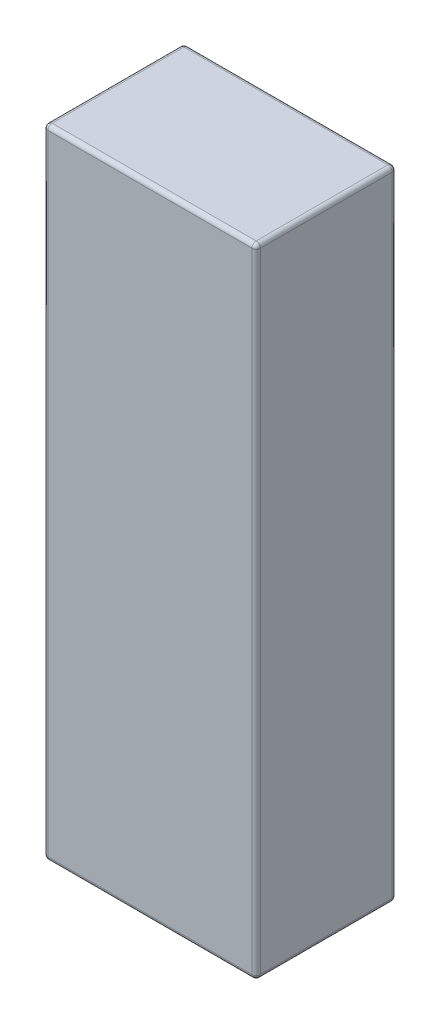
ISO-10303-21;
HEADER;
FILE_DESCRIPTION(('STEP AP214'),'2;1');
FILE_NAME('part.step','',(''),(''),'','','');
FILE_SCHEMA(('AUTOMOTIVE_DESIGN { 1 0 10303 214 1 1 1 1 }'));
ENDSEC;
DATA;
#1=APPLICATION_CONTEXT('core data for automotive mechanical design processes');
#2=APPLICATION_PROTOCOL_DEFINITION('international standard','automotive_design',2000,#1);
#3=PRODUCT_CONTEXT('',#1,'mechanical');
#4=PRODUCT('Part','Part','',(#3));
#5=PRODUCT_RELATED_PRODUCT_CATEGORY('part','',(#4));
#6=PRODUCT_DEFINITION_FORMATION('','',#4);
#7=PRODUCT_DEFINITION_CONTEXT('part definition',#1,'design');
#8=PRODUCT_DEFINITION('design','',#6,#7);
#9=PRODUCT_DEFINITION_SHAPE('','',#8);
#10=(LENGTH_UNIT() NAMED_UNIT(*) SI_UNIT(.MILLI.,.METRE.));
#11=(NAMED_UNIT(*) PLANE_ANGLE_UNIT() SI_UNIT($,.RADIAN.));
#12=(NAMED_UNIT(*) SI_UNIT($,.STERADIAN.) SOLID_ANGLE_UNIT());
#13=UNCERTAINTY_MEASURE_WITH_UNIT(LENGTH_MEASURE(1.E-05),#10,'distance_accuracy_value','');
#14=(GEOMETRIC_REPRESENTATION_CONTEXT(3) GLOBAL_UNCERTAINTY_ASSIGNED_CONTEXT((#13)) GLOBAL_UNIT_ASSIGNED_CONTEXT((#10,
#11,#12)) REPRESENTATION_CONTEXT('',''));
#15=CARTESIAN_POINT('',(0.,0.,0.));
#16=DIRECTION('',(0.,0.,1.));
#17=DIRECTION('',(1.,0.,0.));
#18=AXIS2_PLACEMENT_3D('',#15,#16,#17);
#19=CARTESIAN_POINT('',(25.,75.,16.5));
#20=DIRECTION('',(-1.,0.,0.));
#21=DIRECTION('',(0.,0.,1.));
#22=AXIS2_PLACEMENT_3D('',#19,#20,#21);
#23=PLANE('',#22);
#24=DIRECTION('',(0.,-1.,0.));
#25=VECTOR('',#24,1.);
#26=CARTESIAN_POINT('',(25.,75.,15.5));
#27=LINE('',#26,#25);
#28=CARTESIAN_POINT('',(25.,74.,15.5));
#29=VERTEX_POINT('',#28);
#30=CARTESIAN_POINT('',(25.,-74.,15.5));
#31=VERTEX_POINT('',#30);
#32=EDGE_CURVE('E166',#29,#31,#27,.T.);
#33=ORIENTED_EDGE('',*,*,#32,.T.);
#34=DIRECTION('',(0.,0.,-1.));
#35=VECTOR('',#34,1.);
#36=CARTESIAN_POINT('',(25.,-74.,-16.5));
#37=LINE('',#36,#35);
#38=CARTESIAN_POINT('',(25.,-74.,-15.5));
#39=VERTEX_POINT('',#38);
#40=EDGE_CURVE('E171',#31,#39,#37,.T.);
#41=ORIENTED_EDGE('',*,*,#40,.T.);
#42=DIRECTION('',(0.,-1.,0.));
#43=VECTOR('',#42,1.);
#44=CARTESIAN_POINT('',(25.,75.,-15.5));
#45=LINE('',#44,#43);
#46=CARTESIAN_POINT('',(25.,74.,-15.5));
#47=VERTEX_POINT('',#46);
#48=EDGE_CURVE('E168',#39,#47,#45,.F.);
#49=ORIENTED_EDGE('',*,*,#48,.T.);
#50=DIRECTION('',(0.,0.,-1.));
#51=VECTOR('',#50,1.);
#52=CARTESIAN_POINT('',(25.,74.,16.5));
#53=LINE('',#52,#51);
#54=EDGE_CURVE('E164',#47,#29,#53,.F.);
#55=ORIENTED_EDGE('',*,*,#54,.T.);
#56=EDGE_LOOP('',(#33,#41,#49,#55));
#57=FACE_BOUND('',#56,.T.);
#58=ADVANCED_FACE('F33',(#57),#23,.F.);
#59=CARTESIAN_POINT('',(-25.,75.,-16.5));
#60=DIRECTION('',(0.,0.,1.));
#61=DIRECTION('',(1.,0.,0.));
#62=AXIS2_PLACEMENT_3D('',#59,#60,#61);
#63=PLANE('',#62);
#64=DIRECTION('',(0.,-1.,0.));
#65=VECTOR('',#64,1.);
#66=CARTESIAN_POINT('',(24.,75.,-16.5));
#67=LINE('',#66,#65);
#68=CARTESIAN_POINT('',(24.,74.,-16.5));
#69=VERTEX_POINT('',#68);
#70=CARTESIAN_POINT('',(24.,-74.,-16.5));
#71=VERTEX_POINT('',#70);
#72=EDGE_CURVE('E132',#69,#71,#67,.T.);
#73=ORIENTED_EDGE('',*,*,#72,.T.);
#74=DIRECTION('',(-1.,0.,0.));
#75=VECTOR('',#74,1.);
#76=CARTESIAN_POINT('',(-25.,-74.,-16.5));
#77=LINE('',#76,#75);
#78=CARTESIAN_POINT('',(-24.,-74.,-16.5));
#79=VERTEX_POINT('',#78);
#80=EDGE_CURVE('E128',#71,#79,#77,.T.);
#81=ORIENTED_EDGE('',*,*,#80,.T.);
#82=DIRECTION('',(0.,-1.,0.));
#83=VECTOR('',#82,1.);
#84=CARTESIAN_POINT('',(-24.,75.,-16.5));
#85=LINE('',#84,#83);
#86=CARTESIAN_POINT('',(-24.,74.,-16.5));
#87=VERTEX_POINT('',#86);
#88=EDGE_CURVE('E120',#79,#87,#85,.F.);
#89=ORIENTED_EDGE('',*,*,#88,.T.);
#90=DIRECTION('',(-1.,0.,0.));
#91=VECTOR('',#90,1.);
#92=CARTESIAN_POINT('',(-25.,74.,-16.5));
#93=LINE('',#92,#91);
#94=EDGE_CURVE('E125',#87,#69,#93,.F.);
#95=ORIENTED_EDGE('',*,*,#94,.T.);
#96=EDGE_LOOP('',(#73,#81,#89,#95));
#97=FACE_BOUND('',#96,.T.);
#98=ADVANCED_FACE('F123',(#97),#63,.F.);
#99=CARTESIAN_POINT('',(-25.,75.,16.5));
#100=DIRECTION('',(1.,0.,0.));
#101=DIRECTION('',(0.,0.,-1.));
#102=AXIS2_PLACEMENT_3D('',#99,#100,#101);
#103=PLANE('',#102);
#104=DIRECTION('',(0.,-1.,0.));
#105=VECTOR('',#104,1.);
#106=CARTESIAN_POINT('',(-25.,75.,-15.5));
#107=LINE('',#106,#105);
#108=CARTESIAN_POINT('',(-25.,74.,-15.5));
#109=VERTEX_POINT('',#108);
#110=CARTESIAN_POINT('',(-25.,-74.,-15.5));
#111=VERTEX_POINT('',#110);
#112=EDGE_CURVE('E140',#109,#111,#107,.T.);
#113=ORIENTED_EDGE('',*,*,#112,.T.);
#114=DIRECTION('',(0.,0.,1.));
#115=VECTOR('',#114,1.);
#116=CARTESIAN_POINT('',(-25.,-74.,16.5));
#117=LINE('',#116,#115);
#118=CARTESIAN_POINT('',(-25.,-74.,15.5));
#119=VERTEX_POINT('',#118);
#120=EDGE_CURVE('E178',#111,#119,#117,.T.);
#121=ORIENTED_EDGE('',*,*,#120,.T.);
#122=DIRECTION('',(0.,-1.,0.));
#123=VECTOR('',#122,1.);
#124=CARTESIAN_POINT('',(-25.,75.,15.5));
#125=LINE('',#124,#123);
#126=CARTESIAN_POINT('',(-25.,74.,15.5));
#127=VERTEX_POINT('',#126);
#128=EDGE_CURVE('E175',#119,#127,#125,.F.);
#129=ORIENTED_EDGE('',*,*,#128,.T.);
#130=DIRECTION('',(0.,0.,1.));
#131=VECTOR('',#130,1.);
#132=CARTESIAN_POINT('',(-25.,74.,16.5));
#133=LINE('',#132,#131);
#134=EDGE_CURVE('E173',#127,#109,#133,.F.);
#135=ORIENTED_EDGE('',*,*,#134,.T.);
#136=EDGE_LOOP('',(#113,#121,#129,#135));
#137=FACE_BOUND('',#136,.T.);
#138=ADVANCED_FACE('F324',(#137),#103,.F.);
#139=CARTESIAN_POINT('',(-25.,75.,16.5));
#140=DIRECTION('',(0.,0.,-1.));
#141=DIRECTION('',(-1.,0.,0.));
#142=AXIS2_PLACEMENT_3D('',#139,#140,#141);
#143=PLANE('',#142);
#144=DIRECTION('',(0.,-1.,0.));
#145=VECTOR('',#144,1.);
#146=CARTESIAN_POINT('',(-24.,75.,16.5));
#147=LINE('',#146,#145);
#148=CARTESIAN_POINT('',(-24.,74.,16.5));
#149=VERTEX_POINT('',#148);
#150=CARTESIAN_POINT('',(-24.,-74.,16.5));
#151=VERTEX_POINT('',#150);
#152=EDGE_CURVE('E184',#149,#151,#147,.T.);
#153=ORIENTED_EDGE('',*,*,#152,.T.);
#154=DIRECTION('',(1.,0.,0.));
#155=VECTOR('',#154,1.);
#156=CARTESIAN_POINT('',(25.,-74.,16.5));
#157=LINE('',#156,#155);
#158=CARTESIAN_POINT('',(24.,-74.,16.5));
#159=VERTEX_POINT('',#158);
#160=EDGE_CURVE('E187',#151,#159,#157,.T.);
#161=ORIENTED_EDGE('',*,*,#160,.T.);
#162=DIRECTION('',(0.,-1.,0.));
#163=VECTOR('',#162,1.);
#164=CARTESIAN_POINT('',(24.,75.,16.5));
#165=LINE('',#164,#163);
#166=CARTESIAN_POINT('',(24.,74.,16.5));
#167=VERTEX_POINT('',#166);
#168=EDGE_CURVE('E182',#159,#167,#165,.F.);
#169=ORIENTED_EDGE('',*,*,#168,.T.);
#170=DIRECTION('',(1.,0.,0.));
#171=VECTOR('',#170,1.);
#172=CARTESIAN_POINT('',(-25.,74.,16.5));
#173=LINE('',#172,#171);
#174=EDGE_CURVE('E180',#167,#149,#173,.F.);
#175=ORIENTED_EDGE('',*,*,#174,.T.);
#176=EDGE_LOOP('',(#153,#161,#169,#175));
#177=FACE_BOUND('',#176,.T.);
#178=ADVANCED_FACE('F273',(#177),#143,.F.);
#179=CARTESIAN_POINT('',(0.,75.,0.));
#180=DIRECTION('',(0.,-1.,0.));
#181=DIRECTION('',(0.,0.,-1.));
#182=AXIS2_PLACEMENT_3D('',#179,#180,#181);
#183=PLANE('',#182);
#184=DIRECTION('',(0.,0.,1.));
#185=VECTOR('',#184,1.);
#186=CARTESIAN_POINT('',(-24.,75.,0.));
#187=LINE('',#186,#185);
#188=CARTESIAN_POINT('',(-24.,75.,-15.5));
#189=VERTEX_POINT('',#188);
#190=CARTESIAN_POINT('',(-24.,75.,15.5));
#191=VERTEX_POINT('',#190);
#192=EDGE_CURVE('E42',#189,#191,#187,.T.);
#193=ORIENTED_EDGE('',*,*,#192,.T.);
#194=DIRECTION('',(1.,0.,0.));
#195=VECTOR('',#194,1.);
#196=CARTESIAN_POINT('',(0.,75.,15.5));
#197=LINE('',#196,#195);
#198=CARTESIAN_POINT('',(24.,75.,15.5));
#199=VERTEX_POINT('',#198);
#200=EDGE_CURVE('E11',#191,#199,#197,.T.);
#201=ORIENTED_EDGE('',*,*,#200,.T.);
#202=DIRECTION('',(0.,0.,-1.));
#203=VECTOR('',#202,1.);
#204=CARTESIAN_POINT('',(24.,75.,0.));
#205=LINE('',#204,#203);
#206=CARTESIAN_POINT('',(24.,75.,-15.5));
#207=VERTEX_POINT('',#206);
#208=EDGE_CURVE('E198',#199,#207,#205,.T.);
#209=ORIENTED_EDGE('',*,*,#208,.T.);
#210=DIRECTION('',(-1.,0.,0.));
#211=VECTOR('',#210,1.);
#212=CARTESIAN_POINT('',(0.,75.,-15.5));
#213=LINE('',#212,#211);
#214=EDGE_CURVE('E53',#207,#189,#213,.T.);
#215=ORIENTED_EDGE('',*,*,#214,.T.);
#216=EDGE_LOOP('',(#193,#201,#209,#215));
#217=FACE_BOUND('',#216,.T.);
#218=ADVANCED_FACE('F288',(#217),#183,.F.);
#219=CARTESIAN_POINT('',(0.,-75.,0.));
#220=DIRECTION('',(0.,-1.,0.));
#221=DIRECTION('',(0.,0.,-1.));
#222=AXIS2_PLACEMENT_3D('',#219,#220,#221);
#223=PLANE('',#222);
#224=DIRECTION('',(0.,0.,1.));
#225=VECTOR('',#224,1.);
#226=CARTESIAN_POINT('',(-24.,-75.,-16.5));
#227=LINE('',#226,#225);
#228=CARTESIAN_POINT('',(-24.,-75.,15.5));
#229=VERTEX_POINT('',#228);
#230=CARTESIAN_POINT('',(-24.,-75.,-15.5));
#231=VERTEX_POINT('',#230);
#232=EDGE_CURVE('E193',#229,#231,#227,.F.);
#233=ORIENTED_EDGE('',*,*,#232,.T.);
#234=DIRECTION('',(-1.,0.,0.));
#235=VECTOR('',#234,1.);
#236=CARTESIAN_POINT('',(25.,-75.,-15.5));
#237=LINE('',#236,#235);
#238=CARTESIAN_POINT('',(24.,-75.,-15.5));
#239=VERTEX_POINT('',#238);
#240=EDGE_CURVE('E195',#231,#239,#237,.F.);
#241=ORIENTED_EDGE('',*,*,#240,.T.);
#242=DIRECTION('',(0.,0.,-1.));
#243=VECTOR('',#242,1.);
#244=CARTESIAN_POINT('',(24.,-75.,16.5));
#245=LINE('',#244,#243);
#246=CARTESIAN_POINT('',(24.,-75.,15.5));
#247=VERTEX_POINT('',#246);
#248=EDGE_CURVE('E189',#239,#247,#245,.F.);
#249=ORIENTED_EDGE('',*,*,#248,.T.);
#250=DIRECTION('',(1.,0.,0.));
#251=VECTOR('',#250,1.);
#252=CARTESIAN_POINT('',(-25.,-75.,15.5));
#253=LINE('',#252,#251);
#254=EDGE_CURVE('E191',#247,#229,#253,.F.);
#255=ORIENTED_EDGE('',*,*,#254,.T.);
#256=EDGE_LOOP('',(#233,#241,#249,#255));
#257=FACE_BOUND('',#256,.T.);
#258=ADVANCED_FACE('F264',(#257),#223,.T.);
#259=CARTESIAN_POINT('',(-24.,75.,15.5));
#260=DIRECTION('',(0.,-1.,0.));
#261=DIRECTION('',(0.,0.,-1.));
#262=AXIS2_PLACEMENT_3D('',#259,#260,#261);
#263=CYLINDRICAL_SURFACE('',#262,1.);
#264=CARTESIAN_POINT('',(-24.,74.,15.5));
#265=DIRECTION('',(0.,1.,0.));
#266=DIRECTION('',(0.,0.,1.));
#267=AXIS2_PLACEMENT_3D('',#264,#265,#266);
#268=CIRCLE('',#267,1.);
#269=EDGE_CURVE('E37',#127,#149,#268,.T.);
#270=ORIENTED_EDGE('',*,*,#269,.F.);
#271=ORIENTED_EDGE('',*,*,#128,.F.);
#272=CARTESIAN_POINT('',(-24.,-74.,15.5));
#273=DIRECTION('',(0.,-1.,0.));
#274=DIRECTION('',(0.,0.,-1.));
#275=AXIS2_PLACEMENT_3D('',#272,#273,#274);
#276=CIRCLE('',#275,1.);
#277=EDGE_CURVE('E160',#151,#119,#276,.T.);
#278=ORIENTED_EDGE('',*,*,#277,.F.);
#279=ORIENTED_EDGE('',*,*,#152,.F.);
#280=EDGE_LOOP('',(#270,#271,#278,#279));
#281=FACE_BOUND('',#280,.T.);
#282=ADVANCED_FACE('F35',(#281),#263,.T.);
#283=CARTESIAN_POINT('',(-24.,74.,15.5));
#284=DIRECTION('',(0.,0.,1.));
#285=DIRECTION('',(1.,0.,0.));
#286=AXIS2_PLACEMENT_3D('',#283,#284,#285);
#287=SPHERICAL_SURFACE('',#286,1.);
#288=CARTESIAN_POINT('',(-24.,74.,15.5));
#289=DIRECTION('',(0.,0.,1.));
#290=DIRECTION('',(1.,0.,0.));
#291=AXIS2_PLACEMENT_3D('',#288,#289,#290);
#292=CIRCLE('',#291,1.);
#293=EDGE_CURVE('E244',#127,#191,#292,.F.);
#294=ORIENTED_EDGE('',*,*,#293,.F.);
#295=ORIENTED_EDGE('',*,*,#269,.T.);
#296=CARTESIAN_POINT('',(-24.,74.,15.5));
#297=DIRECTION('',(-1.,0.,0.));
#298=DIRECTION('',(0.,0.,1.));
#299=AXIS2_PLACEMENT_3D('',#296,#297,#298);
#300=CIRCLE('',#299,1.);
#301=EDGE_CURVE('E246',#191,#149,#300,.F.);
#302=ORIENTED_EDGE('',*,*,#301,.F.);
#303=EDGE_LOOP('',(#294,#295,#302));
#304=FACE_BOUND('',#303,.T.);
#305=ADVANCED_FACE('F457',(#304),#287,.T.);
#306=CARTESIAN_POINT('',(-24.,-74.,15.5));
#307=DIRECTION('',(0.,0.,1.));
#308=DIRECTION('',(1.,0.,0.));
#309=AXIS2_PLACEMENT_3D('',#306,#307,#308);
#310=SPHERICAL_SURFACE('',#309,1.);
#311=CARTESIAN_POINT('',(-24.,-74.,15.5));
#312=DIRECTION('',(-1.,0.,0.));
#313=DIRECTION('',(0.,0.,1.));
#314=AXIS2_PLACEMENT_3D('',#311,#312,#313);
#315=CIRCLE('',#314,1.);
#316=EDGE_CURVE('E238',#151,#229,#315,.F.);
#317=ORIENTED_EDGE('',*,*,#316,.F.);
#318=ORIENTED_EDGE('',*,*,#277,.T.);
#319=CARTESIAN_POINT('',(-24.,-74.,15.5));
#320=DIRECTION('',(0.,0.,1.));
#321=DIRECTION('',(1.,0.,0.));
#322=AXIS2_PLACEMENT_3D('',#319,#320,#321);
#323=CIRCLE('',#322,1.);
#324=EDGE_CURVE('E241',#229,#119,#323,.F.);
#325=ORIENTED_EDGE('',*,*,#324,.F.);
#326=EDGE_LOOP('',(#317,#318,#325));
#327=FACE_BOUND('',#326,.T.);
#328=ADVANCED_FACE('F253',(#327),#310,.T.);
#329=CARTESIAN_POINT('',(0.,74.,15.5));
#330=DIRECTION('',(1.,0.,0.));
#331=DIRECTION('',(0.,0.,-1.));
#332=AXIS2_PLACEMENT_3D('',#329,#330,#331);
#333=CYLINDRICAL_SURFACE('',#332,1.);
#334=ORIENTED_EDGE('',*,*,#301,.T.);
#335=ORIENTED_EDGE('',*,*,#174,.F.);
#336=CARTESIAN_POINT('',(24.,74.,15.5));
#337=DIRECTION('',(1.,0.,0.));
#338=DIRECTION('',(0.,0.,-1.));
#339=AXIS2_PLACEMENT_3D('',#336,#337,#338);
#340=CIRCLE('',#339,1.);
#341=EDGE_CURVE('E232',#199,#167,#340,.T.);
#342=ORIENTED_EDGE('',*,*,#341,.F.);
#343=ORIENTED_EDGE('',*,*,#200,.F.);
#344=EDGE_LOOP('',(#334,#335,#342,#343));
#345=FACE_BOUND('',#344,.T.);
#346=ADVANCED_FACE('F287',(#345),#333,.T.);
#347=CARTESIAN_POINT('',(-24.,74.,0.));
#348=DIRECTION('',(0.,0.,1.));
#349=DIRECTION('',(1.,0.,0.));
#350=AXIS2_PLACEMENT_3D('',#347,#348,#349);
#351=CYLINDRICAL_SURFACE('',#350,1.);
#352=ORIENTED_EDGE('',*,*,#293,.T.);
#353=ORIENTED_EDGE('',*,*,#192,.F.);
#354=CARTESIAN_POINT('',(-24.,74.,-15.5));
#355=DIRECTION('',(0.,0.,-1.));
#356=DIRECTION('',(-1.,0.,0.));
#357=AXIS2_PLACEMENT_3D('',#354,#355,#356);
#358=CIRCLE('',#357,1.);
#359=EDGE_CURVE('E144',#109,#189,#358,.T.);
#360=ORIENTED_EDGE('',*,*,#359,.F.);
#361=ORIENTED_EDGE('',*,*,#134,.F.);
#362=EDGE_LOOP('',(#352,#353,#360,#361));
#363=FACE_BOUND('',#362,.T.);
#364=ADVANCED_FACE('F434',(#363),#351,.T.);
#365=CARTESIAN_POINT('',(-24.,75.,-15.5));
#366=DIRECTION('',(0.,-1.,0.));
#367=DIRECTION('',(0.,0.,-1.));
#368=AXIS2_PLACEMENT_3D('',#365,#366,#367);
#369=CYLINDRICAL_SURFACE('',#368,1.);
#370=CARTESIAN_POINT('',(-24.,-74.,-15.5));
#371=DIRECTION('',(0.,-1.,0.));
#372=DIRECTION('',(0.,0.,-1.));
#373=AXIS2_PLACEMENT_3D('',#370,#371,#372);
#374=CIRCLE('',#373,1.);
#375=EDGE_CURVE('E145',#111,#79,#374,.T.);
#376=ORIENTED_EDGE('',*,*,#375,.F.);
#377=ORIENTED_EDGE('',*,*,#112,.F.);
#378=CARTESIAN_POINT('',(-24.,74.,-15.5));
#379=DIRECTION('',(0.,1.,0.));
#380=DIRECTION('',(0.,0.,1.));
#381=AXIS2_PLACEMENT_3D('',#378,#379,#380);
#382=CIRCLE('',#381,1.);
#383=EDGE_CURVE('E136',#87,#109,#382,.T.);
#384=ORIENTED_EDGE('',*,*,#383,.F.);
#385=ORIENTED_EDGE('',*,*,#88,.F.);
#386=EDGE_LOOP('',(#376,#377,#384,#385));
#387=FACE_BOUND('',#386,.T.);
#388=ADVANCED_FACE('F138',(#387),#369,.T.);
#389=CARTESIAN_POINT('',(-24.,-74.,16.5));
#390=DIRECTION('',(0.,0.,-1.));
#391=DIRECTION('',(-1.,0.,0.));
#392=AXIS2_PLACEMENT_3D('',#389,#390,#391);
#393=CYLINDRICAL_SURFACE('',#392,1.);
#394=ORIENTED_EDGE('',*,*,#324,.T.);
#395=ORIENTED_EDGE('',*,*,#120,.F.);
#396=CARTESIAN_POINT('',(-24.,-74.,-15.5));
#397=DIRECTION('',(0.,0.,-1.));
#398=DIRECTION('',(-1.,0.,0.));
#399=AXIS2_PLACEMENT_3D('',#396,#397,#398);
#400=CIRCLE('',#399,1.);
#401=EDGE_CURVE('E228',#231,#111,#400,.T.);
#402=ORIENTED_EDGE('',*,*,#401,.F.);
#403=ORIENTED_EDGE('',*,*,#232,.F.);
#404=EDGE_LOOP('',(#394,#395,#402,#403));
#405=FACE_BOUND('',#404,.T.);
#406=ADVANCED_FACE('F260',(#405),#393,.T.);
#407=CARTESIAN_POINT('',(-25.,-74.,15.5));
#408=DIRECTION('',(-1.,0.,0.));
#409=DIRECTION('',(0.,0.,1.));
#410=AXIS2_PLACEMENT_3D('',#407,#408,#409);
#411=CYLINDRICAL_SURFACE('',#410,1.);
#412=ORIENTED_EDGE('',*,*,#316,.T.);
#413=ORIENTED_EDGE('',*,*,#254,.F.);
#414=CARTESIAN_POINT('',(24.,-74.,15.5));
#415=DIRECTION('',(1.,0.,0.));
#416=DIRECTION('',(0.,0.,-1.));
#417=AXIS2_PLACEMENT_3D('',#414,#415,#416);
#418=CIRCLE('',#417,1.);
#419=EDGE_CURVE('E225',#159,#247,#418,.T.);
#420=ORIENTED_EDGE('',*,*,#419,.F.);
#421=ORIENTED_EDGE('',*,*,#160,.F.);
#422=EDGE_LOOP('',(#412,#413,#420,#421));
#423=FACE_BOUND('',#422,.T.);
#424=ADVANCED_FACE('F270',(#423),#411,.T.);
#425=CARTESIAN_POINT('',(24.,75.,15.5));
#426=DIRECTION('',(0.,-1.,0.));
#427=DIRECTION('',(0.,0.,-1.));
#428=AXIS2_PLACEMENT_3D('',#425,#426,#427);
#429=CYLINDRICAL_SURFACE('',#428,1.);
#430=CARTESIAN_POINT('',(24.,74.,15.5));
#431=DIRECTION('',(0.,1.,0.));
#432=DIRECTION('',(0.,0.,1.));
#433=AXIS2_PLACEMENT_3D('',#430,#431,#432);
#434=CIRCLE('',#433,1.);
#435=EDGE_CURVE('E235',#167,#29,#434,.T.);
#436=ORIENTED_EDGE('',*,*,#435,.F.);
#437=ORIENTED_EDGE('',*,*,#168,.F.);
#438=CARTESIAN_POINT('',(24.,-74.,15.5));
#439=DIRECTION('',(0.,-1.,0.));
#440=DIRECTION('',(0.,0.,-1.));
#441=AXIS2_PLACEMENT_3D('',#438,#439,#440);
#442=CIRCLE('',#441,1.);
#443=EDGE_CURVE('E222',#31,#159,#442,.T.);
#444=ORIENTED_EDGE('',*,*,#443,.F.);
#445=ORIENTED_EDGE('',*,*,#32,.F.);
#446=EDGE_LOOP('',(#436,#437,#444,#445));
#447=FACE_BOUND('',#446,.T.);
#448=ADVANCED_FACE('F278',(#447),#429,.T.);
#449=CARTESIAN_POINT('',(24.,74.,15.5));
#450=DIRECTION('',(0.,0.,1.));
#451=DIRECTION('',(1.,0.,0.));
#452=AXIS2_PLACEMENT_3D('',#449,#450,#451);
#453=SPHERICAL_SURFACE('',#452,1.);
#454=ORIENTED_EDGE('',*,*,#341,.T.);
#455=ORIENTED_EDGE('',*,*,#435,.T.);
#456=CARTESIAN_POINT('',(24.,74.,15.5));
#457=DIRECTION('',(0.,0.,1.));
#458=DIRECTION('',(1.,0.,0.));
#459=AXIS2_PLACEMENT_3D('',#456,#457,#458);
#460=CIRCLE('',#459,1.);
#461=EDGE_CURVE('E151',#199,#29,#460,.F.);
#462=ORIENTED_EDGE('',*,*,#461,.F.);
#463=EDGE_LOOP('',(#454,#455,#462));
#464=FACE_BOUND('',#463,.T.);
#465=ADVANCED_FACE('F284',(#464),#453,.T.);
#466=CARTESIAN_POINT('',(-24.,74.,-15.5));
#467=DIRECTION('',(0.,0.,1.));
#468=DIRECTION('',(1.,0.,0.));
#469=AXIS2_PLACEMENT_3D('',#466,#467,#468);
#470=SPHERICAL_SURFACE('',#469,1.);
#471=ORIENTED_EDGE('',*,*,#383,.T.);
#472=ORIENTED_EDGE('',*,*,#359,.T.);
#473=CARTESIAN_POINT('',(-24.,74.,-15.5));
#474=DIRECTION('',(-1.,0.,0.));
#475=DIRECTION('',(0.,0.,1.));
#476=AXIS2_PLACEMENT_3D('',#473,#474,#475);
#477=CIRCLE('',#476,1.);
#478=EDGE_CURVE('E148',#87,#189,#477,.F.);
#479=ORIENTED_EDGE('',*,*,#478,.F.);
#480=EDGE_LOOP('',(#471,#472,#479));
#481=FACE_BOUND('',#480,.T.);
#482=ADVANCED_FACE('F149',(#481),#470,.T.);
#483=CARTESIAN_POINT('',(-24.,-74.,-15.5));
#484=DIRECTION('',(0.,0.,1.));
#485=DIRECTION('',(1.,0.,0.));
#486=AXIS2_PLACEMENT_3D('',#483,#484,#485);
#487=SPHERICAL_SURFACE('',#486,1.);
#488=ORIENTED_EDGE('',*,*,#401,.T.);
#489=ORIENTED_EDGE('',*,*,#375,.T.);
#490=CARTESIAN_POINT('',(-24.,-74.,-15.5));
#491=DIRECTION('',(-1.,0.,0.));
#492=DIRECTION('',(0.,0.,1.));
#493=AXIS2_PLACEMENT_3D('',#490,#491,#492);
#494=CIRCLE('',#493,1.);
#495=EDGE_CURVE('E152',#231,#79,#494,.F.);
#496=ORIENTED_EDGE('',*,*,#495,.F.);
#497=EDGE_LOOP('',(#488,#489,#496));
#498=FACE_BOUND('',#497,.T.);
#499=ADVANCED_FACE('F307',(#498),#487,.T.);
#500=CARTESIAN_POINT('',(24.,-74.,15.5));
#501=DIRECTION('',(0.,0.,1.));
#502=DIRECTION('',(1.,0.,0.));
#503=AXIS2_PLACEMENT_3D('',#500,#501,#502);
#504=SPHERICAL_SURFACE('',#503,1.);
#505=ORIENTED_EDGE('',*,*,#443,.T.);
#506=ORIENTED_EDGE('',*,*,#419,.T.);
#507=CARTESIAN_POINT('',(24.,-74.,15.5));
#508=DIRECTION('',(0.,0.,1.));
#509=DIRECTION('',(1.,0.,0.));
#510=AXIS2_PLACEMENT_3D('',#507,#508,#509);
#511=CIRCLE('',#510,1.);
#512=EDGE_CURVE('E215',#31,#247,#511,.F.);
#513=ORIENTED_EDGE('',*,*,#512,.F.);
#514=EDGE_LOOP('',(#505,#506,#513));
#515=FACE_BOUND('',#514,.T.);
#516=ADVANCED_FACE('F309',(#515),#504,.T.);
#517=CARTESIAN_POINT('',(24.,74.,0.));
#518=DIRECTION('',(0.,0.,-1.));
#519=DIRECTION('',(-1.,0.,0.));
#520=AXIS2_PLACEMENT_3D('',#517,#518,#519);
#521=CYLINDRICAL_SURFACE('',#520,1.);
#522=ORIENTED_EDGE('',*,*,#461,.T.);
#523=ORIENTED_EDGE('',*,*,#54,.F.);
#524=CARTESIAN_POINT('',(24.,74.,-15.5));
#525=DIRECTION('',(0.,0.,-1.));
#526=DIRECTION('',(-1.,0.,0.));
#527=AXIS2_PLACEMENT_3D('',#524,#525,#526);
#528=CIRCLE('',#527,1.);
#529=EDGE_CURVE('E212',#207,#47,#528,.T.);
#530=ORIENTED_EDGE('',*,*,#529,.F.);
#531=ORIENTED_EDGE('',*,*,#208,.F.);
#532=EDGE_LOOP('',(#522,#523,#530,#531));
#533=FACE_BOUND('',#532,.T.);
#534=ADVANCED_FACE('F292',(#533),#521,.T.);
#535=CARTESIAN_POINT('',(0.,74.,-15.5));
#536=DIRECTION('',(-1.,0.,0.));
#537=DIRECTION('',(0.,0.,1.));
#538=AXIS2_PLACEMENT_3D('',#535,#536,#537);
#539=CYLINDRICAL_SURFACE('',#538,1.);
#540=ORIENTED_EDGE('',*,*,#478,.T.);
#541=ORIENTED_EDGE('',*,*,#214,.F.);
#542=CARTESIAN_POINT('',(24.,74.,-15.5));
#543=DIRECTION('',(1.,0.,0.));
#544=DIRECTION('',(0.,0.,-1.));
#545=AXIS2_PLACEMENT_3D('',#542,#543,#544);
#546=CIRCLE('',#545,1.);
#547=EDGE_CURVE('E156',#69,#207,#546,.T.);
#548=ORIENTED_EDGE('',*,*,#547,.F.);
#549=ORIENTED_EDGE('',*,*,#94,.F.);
#550=EDGE_LOOP('',(#540,#541,#548,#549));
#551=FACE_BOUND('',#550,.T.);
#552=ADVANCED_FACE('F154',(#551),#539,.T.);
#553=CARTESIAN_POINT('',(-25.,-74.,-15.5));
#554=DIRECTION('',(1.,0.,0.));
#555=DIRECTION('',(0.,0.,-1.));
#556=AXIS2_PLACEMENT_3D('',#553,#554,#555);
#557=CYLINDRICAL_SURFACE('',#556,1.);
#558=ORIENTED_EDGE('',*,*,#495,.T.);
#559=ORIENTED_EDGE('',*,*,#80,.F.);
#560=CARTESIAN_POINT('',(24.,-74.,-15.5));
#561=DIRECTION('',(1.,0.,0.));
#562=DIRECTION('',(0.,0.,-1.));
#563=AXIS2_PLACEMENT_3D('',#560,#561,#562);
#564=CIRCLE('',#563,1.);
#565=EDGE_CURVE('E208',#239,#71,#564,.T.);
#566=ORIENTED_EDGE('',*,*,#565,.F.);
#567=ORIENTED_EDGE('',*,*,#240,.F.);
#568=EDGE_LOOP('',(#558,#559,#566,#567));
#569=FACE_BOUND('',#568,.T.);
#570=ADVANCED_FACE('F305',(#569),#557,.T.);
#571=CARTESIAN_POINT('',(24.,-74.,16.5));
#572=DIRECTION('',(0.,0.,1.));
#573=DIRECTION('',(1.,0.,0.));
#574=AXIS2_PLACEMENT_3D('',#571,#572,#573);
#575=CYLINDRICAL_SURFACE('',#574,1.);
#576=ORIENTED_EDGE('',*,*,#512,.T.);
#577=ORIENTED_EDGE('',*,*,#248,.F.);
#578=CARTESIAN_POINT('',(24.,-74.,-15.5));
#579=DIRECTION('',(0.,0.,-1.));
#580=DIRECTION('',(-1.,0.,0.));
#581=AXIS2_PLACEMENT_3D('',#578,#579,#580);
#582=CIRCLE('',#581,1.);
#583=EDGE_CURVE('E206',#39,#239,#582,.T.);
#584=ORIENTED_EDGE('',*,*,#583,.F.);
#585=ORIENTED_EDGE('',*,*,#40,.F.);
#586=EDGE_LOOP('',(#576,#577,#584,#585));
#587=FACE_BOUND('',#586,.T.);
#588=ADVANCED_FACE('F334',(#587),#575,.T.);
#589=CARTESIAN_POINT('',(24.,74.,-15.5));
#590=DIRECTION('',(0.,0.,1.));
#591=DIRECTION('',(1.,0.,0.));
#592=AXIS2_PLACEMENT_3D('',#589,#590,#591);
#593=SPHERICAL_SURFACE('',#592,1.);
#594=ORIENTED_EDGE('',*,*,#547,.T.);
#595=ORIENTED_EDGE('',*,*,#529,.T.);
#596=CARTESIAN_POINT('',(24.,74.,-15.5));
#597=DIRECTION('',(0.,1.,0.));
#598=DIRECTION('',(0.,0.,1.));
#599=AXIS2_PLACEMENT_3D('',#596,#597,#598);
#600=CIRCLE('',#599,1.);
#601=EDGE_CURVE('E204',#69,#47,#600,.F.);
#602=ORIENTED_EDGE('',*,*,#601,.F.);
#603=EDGE_LOOP('',(#594,#595,#602));
#604=FACE_BOUND('',#603,.T.);
#605=ADVANCED_FACE('F294',(#604),#593,.T.);
#606=CARTESIAN_POINT('',(24.,-74.,-15.5));
#607=DIRECTION('',(0.,0.,1.));
#608=DIRECTION('',(1.,0.,0.));
#609=AXIS2_PLACEMENT_3D('',#606,#607,#608);
#610=SPHERICAL_SURFACE('',#609,1.);
#611=ORIENTED_EDGE('',*,*,#583,.T.);
#612=ORIENTED_EDGE('',*,*,#565,.T.);
#613=CARTESIAN_POINT('',(24.,-74.,-15.5));
#614=DIRECTION('',(0.,-1.,0.));
#615=DIRECTION('',(0.,0.,-1.));
#616=AXIS2_PLACEMENT_3D('',#613,#614,#615);
#617=CIRCLE('',#616,1.);
#618=EDGE_CURVE('E202',#39,#71,#617,.F.);
#619=ORIENTED_EDGE('',*,*,#618,.F.);
#620=EDGE_LOOP('',(#611,#612,#619));
#621=FACE_BOUND('',#620,.T.);
#622=ADVANCED_FACE('F302',(#621),#610,.T.);
#623=CARTESIAN_POINT('',(24.,75.,-15.5));
#624=DIRECTION('',(0.,-1.,0.));
#625=DIRECTION('',(0.,0.,-1.));
#626=AXIS2_PLACEMENT_3D('',#623,#624,#625);
#627=CYLINDRICAL_SURFACE('',#626,1.);
#628=ORIENTED_EDGE('',*,*,#601,.T.);
#629=ORIENTED_EDGE('',*,*,#48,.F.);
#630=ORIENTED_EDGE('',*,*,#618,.T.);
#631=ORIENTED_EDGE('',*,*,#72,.F.);
#632=EDGE_LOOP('',(#628,#629,#630,#631));
#633=FACE_BOUND('',#632,.T.);
#634=ADVANCED_FACE('F298',(#633),#627,.T.);
#635=CLOSED_SHELL('',(#58,#98,#138,#178,#218,#258,#282,#305,#328,#346,#364,#388,#406,#424,#448,
#465,#482,#499,#516,#534,#552,#570,#588,#605,#622,#634));
#636=MANIFOLD_SOLID_BREP('B2',#635);
#637=ADVANCED_BREP_SHAPE_REPRESENTATION('',(#18,#636),#14);
#638=SHAPE_DEFINITION_REPRESENTATION(#9,#637);
ENDSEC;
END-ISO-10303-21;
